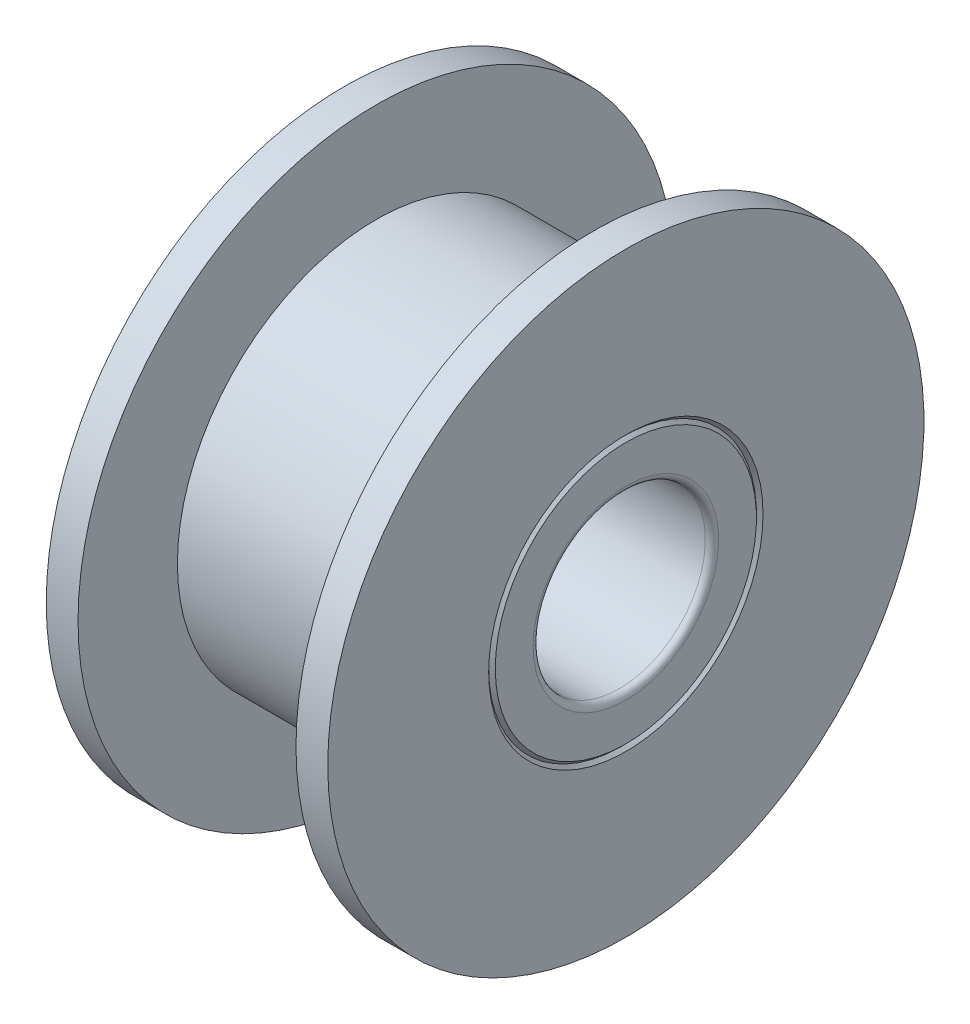
ISO-10303-21;
HEADER;
FILE_DESCRIPTION(('STEP AP214'),'2;1');
FILE_NAME('part.step','',(''),(''),'','','');
FILE_SCHEMA(('AUTOMOTIVE_DESIGN { 1 0 10303 214 1 1 1 1 }'));
ENDSEC;
DATA;
#1=APPLICATION_CONTEXT('core data for automotive mechanical design processes');
#2=APPLICATION_PROTOCOL_DEFINITION('international standard','automotive_design',2000,#1);
#3=PRODUCT_CONTEXT('',#1,'mechanical');
#4=PRODUCT('Part','Part','',(#3));
#5=PRODUCT_RELATED_PRODUCT_CATEGORY('part','',(#4));
#6=PRODUCT_DEFINITION_FORMATION('','',#4);
#7=PRODUCT_DEFINITION_CONTEXT('part definition',#1,'design');
#8=PRODUCT_DEFINITION('design','',#6,#7);
#9=PRODUCT_DEFINITION_SHAPE('','',#8);
#10=(LENGTH_UNIT() NAMED_UNIT(*) SI_UNIT(.MILLI.,.METRE.));
#11=(NAMED_UNIT(*) PLANE_ANGLE_UNIT() SI_UNIT($,.RADIAN.));
#12=(NAMED_UNIT(*) SI_UNIT($,.STERADIAN.) SOLID_ANGLE_UNIT());
#13=UNCERTAINTY_MEASURE_WITH_UNIT(LENGTH_MEASURE(1.E-05),#10,'distance_accuracy_value','');
#14=(GEOMETRIC_REPRESENTATION_CONTEXT(3) GLOBAL_UNCERTAINTY_ASSIGNED_CONTEXT((#13)) GLOBAL_UNIT_ASSIGNED_CONTEXT((#10,
#11,#12)) REPRESENTATION_CONTEXT('',''));
#15=CARTESIAN_POINT('',(0.,0.,0.));
#16=DIRECTION('',(0.,0.,1.));
#17=DIRECTION('',(1.,0.,0.));
#18=AXIS2_PLACEMENT_3D('',#15,#16,#17);
#19=CARTESIAN_POINT('',(5.5,-1.5,0.));
#20=DIRECTION('',(1.,0.,0.));
#21=DIRECTION('',(0.,0.,-1.));
#22=AXIS2_PLACEMENT_3D('',#19,#20,#21);
#23=CONICAL_SURFACE('',#22,3.85760839057917,0.942292393865584);
#24=CARTESIAN_POINT('',(5.60349390049167,-1.5,0.));
#25=DIRECTION('',(-1.,0.,0.));
#26=DIRECTION('',(0.,0.,1.));
#27=AXIS2_PLACEMENT_3D('',#24,#25,#26);
#28=CIRCLE('',#27,4.);
#29=CARTESIAN_POINT('',(5.60349390049167,-1.5,4.));
#30=VERTEX_POINT('',#29);
#31=EDGE_CURVE('E97',#30,#30,#28,.T.);
#32=ORIENTED_EDGE('',*,*,#31,.T.);
#33=EDGE_LOOP('',(#32));
#34=FACE_BOUND('',#33,.T.);
#35=CARTESIAN_POINT('',(5.5,-1.5,0.));
#36=DIRECTION('',(-1.,0.,0.));
#37=DIRECTION('',(0.,0.,1.));
#38=AXIS2_PLACEMENT_3D('',#35,#36,#37);
#39=CIRCLE('',#38,3.85760839057917);
#40=CARTESIAN_POINT('',(5.5,-1.5,3.85760839057917));
#41=VERTEX_POINT('',#40);
#42=EDGE_CURVE('E64',#41,#41,#39,.T.);
#43=ORIENTED_EDGE('',*,*,#42,.F.);
#44=EDGE_LOOP('',(#43));
#45=FACE_BOUND('',#44,.T.);
#46=ADVANCED_FACE('F44',(#34,#45),#23,.T.);
#47=CARTESIAN_POINT('',(5.5,0.,0.));
#48=DIRECTION('',(1.,0.,0.));
#49=DIRECTION('',(0.,0.,-1.));
#50=AXIS2_PLACEMENT_3D('',#47,#48,#49);
#51=PLANE('',#50);
#52=CARTESIAN_POINT('',(5.5,-1.5,0.));
#53=DIRECTION('',(1.,0.,0.));
#54=DIRECTION('',(0.,0.,-1.));
#55=AXIS2_PLACEMENT_3D('',#52,#53,#54);
#56=CIRCLE('',#55,2.8);
#57=CARTESIAN_POINT('',(5.5,-1.5,-2.8));
#58=VERTEX_POINT('',#57);
#59=EDGE_CURVE('E12',#58,#58,#56,.T.);
#60=ORIENTED_EDGE('',*,*,#59,.T.);
#61=EDGE_LOOP('',(#60));
#62=FACE_BOUND('',#61,.T.);
#63=ORIENTED_EDGE('',*,*,#42,.T.);
#64=EDGE_LOOP('',(#63));
#65=FACE_BOUND('',#64,.T.);
#66=ADVANCED_FACE('F118',(#62,#65),#51,.F.);
#67=CARTESIAN_POINT('',(0.999999999999999,-1.5,0.));
#68=DIRECTION('',(-1.,0.,0.));
#69=DIRECTION('',(0.,0.,1.));
#70=AXIS2_PLACEMENT_3D('',#67,#68,#69);
#71=CYLINDRICAL_SURFACE('',#70,2.6);
#72=CARTESIAN_POINT('',(13.8,-1.5,0.));
#73=DIRECTION('',(-1.,0.,0.));
#74=DIRECTION('',(0.,0.,1.));
#75=AXIS2_PLACEMENT_3D('',#72,#73,#74);
#76=CIRCLE('',#75,2.6);
#77=CARTESIAN_POINT('',(13.8,-1.5,2.6));
#78=VERTEX_POINT('',#77);
#79=EDGE_CURVE('E51',#78,#78,#76,.F.);
#80=ORIENTED_EDGE('',*,*,#79,.T.);
#81=EDGE_LOOP('',(#80));
#82=FACE_BOUND('',#81,.T.);
#83=CARTESIAN_POINT('',(5.7,-1.5,0.));
#84=DIRECTION('',(1.,0.,0.));
#85=DIRECTION('',(0.,0.,-1.));
#86=AXIS2_PLACEMENT_3D('',#83,#84,#85);
#87=CIRCLE('',#86,2.6);
#88=CARTESIAN_POINT('',(5.7,-1.5,-2.6));
#89=VERTEX_POINT('',#88);
#90=EDGE_CURVE('E55',#89,#89,#87,.F.);
#91=ORIENTED_EDGE('',*,*,#90,.T.);
#92=EDGE_LOOP('',(#91));
#93=FACE_BOUND('',#92,.T.);
#94=ADVANCED_FACE('F123',(#82,#93),#71,.F.);
#95=CARTESIAN_POINT('',(14.,0.,0.));
#96=DIRECTION('',(-1.,0.,0.));
#97=DIRECTION('',(0.,0.,1.));
#98=AXIS2_PLACEMENT_3D('',#95,#96,#97);
#99=PLANE('',#98);
#100=CARTESIAN_POINT('',(14.,-1.5,0.));
#101=DIRECTION('',(-1.,0.,0.));
#102=DIRECTION('',(0.,0.,1.));
#103=AXIS2_PLACEMENT_3D('',#100,#101,#102);
#104=CIRCLE('',#103,2.8);
#105=CARTESIAN_POINT('',(14.,-1.5,2.8));
#106=VERTEX_POINT('',#105);
#107=EDGE_CURVE('E59',#106,#106,#104,.T.);
#108=ORIENTED_EDGE('',*,*,#107,.T.);
#109=EDGE_LOOP('',(#108));
#110=FACE_BOUND('',#109,.T.);
#111=CARTESIAN_POINT('',(14.,-1.5,0.));
#112=DIRECTION('',(-1.,0.,0.));
#113=DIRECTION('',(0.,0.,1.));
#114=AXIS2_PLACEMENT_3D('',#111,#112,#113);
#115=CIRCLE('',#114,3.94239160942083);
#116=CARTESIAN_POINT('',(14.,-1.5,3.94239160942083));
#117=VERTEX_POINT('',#116);
#118=EDGE_CURVE('E67',#117,#117,#115,.T.);
#119=ORIENTED_EDGE('',*,*,#118,.F.);
#120=EDGE_LOOP('',(#119));
#121=FACE_BOUND('',#120,.T.);
#122=ADVANCED_FACE('F128',(#110,#121),#99,.F.);
#123=CARTESIAN_POINT('',(14.,-1.5,0.));
#124=DIRECTION('',(-1.,0.,0.));
#125=DIRECTION('',(0.,0.,1.));
#126=AXIS2_PLACEMENT_3D('',#123,#124,#125);
#127=CONICAL_SURFACE('',#126,3.94239160942083,0.785398163397448);
#128=CARTESIAN_POINT('',(13.9,-1.5,0.));
#129=DIRECTION('',(-1.,0.,0.));
#130=DIRECTION('',(0.,0.,1.));
#131=AXIS2_PLACEMENT_3D('',#128,#129,#130);
#132=CIRCLE('',#131,4.04239160942083);
#133=CARTESIAN_POINT('',(13.9,-1.5,4.04239160942083));
#134=VERTEX_POINT('',#133);
#135=EDGE_CURVE('E70',#134,#134,#132,.T.);
#136=ORIENTED_EDGE('',*,*,#135,.F.);
#137=EDGE_LOOP('',(#136));
#138=FACE_BOUND('',#137,.T.);
#139=ORIENTED_EDGE('',*,*,#118,.T.);
#140=EDGE_LOOP('',(#139));
#141=FACE_BOUND('',#140,.T.);
#142=ADVANCED_FACE('F131',(#138,#141),#127,.T.);
#143=CARTESIAN_POINT('',(13.9,-1.5,0.));
#144=DIRECTION('',(1.,0.,0.));
#145=DIRECTION('',(0.,0.,-1.));
#146=AXIS2_PLACEMENT_3D('',#143,#144,#145);
#147=CONICAL_SURFACE('',#146,4.04239160942083,0.78539816339747);
#148=CARTESIAN_POINT('',(14.,-1.5,0.));
#149=DIRECTION('',(-1.,0.,0.));
#150=DIRECTION('',(0.,0.,1.));
#151=AXIS2_PLACEMENT_3D('',#148,#149,#150);
#152=CIRCLE('',#151,4.14239160942083);
#153=CARTESIAN_POINT('',(14.,-1.5,4.14239160942083));
#154=VERTEX_POINT('',#153);
#155=EDGE_CURVE('E73',#154,#154,#152,.T.);
#156=ORIENTED_EDGE('',*,*,#155,.F.);
#157=EDGE_LOOP('',(#156));
#158=FACE_BOUND('',#157,.T.);
#159=ORIENTED_EDGE('',*,*,#135,.T.);
#160=EDGE_LOOP('',(#159));
#161=FACE_BOUND('',#160,.T.);
#162=ADVANCED_FACE('F135',(#158,#161),#147,.F.);
#163=CARTESIAN_POINT('',(14.,0.,0.));
#164=DIRECTION('',(-1.,0.,0.));
#165=DIRECTION('',(0.,0.,1.));
#166=AXIS2_PLACEMENT_3D('',#163,#164,#165);
#167=PLANE('',#166);
#168=CARTESIAN_POINT('',(14.,-1.5,0.));
#169=DIRECTION('',(-1.,0.,0.));
#170=DIRECTION('',(0.,0.,1.));
#171=AXIS2_PLACEMENT_3D('',#168,#169,#170);
#172=CIRCLE('',#171,9.);
#173=CARTESIAN_POINT('',(14.,-1.5,9.));
#174=VERTEX_POINT('',#173);
#175=EDGE_CURVE('E76',#174,#174,#172,.T.);
#176=ORIENTED_EDGE('',*,*,#175,.F.);
#177=EDGE_LOOP('',(#176));
#178=FACE_BOUND('',#177,.T.);
#179=ORIENTED_EDGE('',*,*,#155,.T.);
#180=EDGE_LOOP('',(#179));
#181=FACE_BOUND('',#180,.T.);
#182=ADVANCED_FACE('F139',(#178,#181),#167,.F.);
#183=CARTESIAN_POINT('',(0.999999999999999,-1.5,0.));
#184=DIRECTION('',(-1.,0.,0.));
#185=DIRECTION('',(0.,0.,1.));
#186=AXIS2_PLACEMENT_3D('',#183,#184,#185);
#187=CYLINDRICAL_SURFACE('',#186,9.);
#188=ORIENTED_EDGE('',*,*,#175,.T.);
#189=EDGE_LOOP('',(#188));
#190=FACE_BOUND('',#189,.T.);
#191=CARTESIAN_POINT('',(13.04,-1.5,0.));
#192=DIRECTION('',(-1.,0.,0.));
#193=DIRECTION('',(0.,0.,1.));
#194=AXIS2_PLACEMENT_3D('',#191,#192,#193);
#195=CIRCLE('',#194,9.);
#196=CARTESIAN_POINT('',(13.04,-1.5,9.));
#197=VERTEX_POINT('',#196);
#198=EDGE_CURVE('E79',#197,#197,#195,.T.);
#199=ORIENTED_EDGE('',*,*,#198,.F.);
#200=EDGE_LOOP('',(#199));
#201=FACE_BOUND('',#200,.T.);
#202=ADVANCED_FACE('F143',(#190,#201),#187,.T.);
#203=CARTESIAN_POINT('',(13.04,0.,0.));
#204=DIRECTION('',(-1.,0.,0.));
#205=DIRECTION('',(0.,0.,1.));
#206=AXIS2_PLACEMENT_3D('',#203,#204,#205);
#207=PLANE('',#206);
#208=ORIENTED_EDGE('',*,*,#198,.T.);
#209=EDGE_LOOP('',(#208));
#210=FACE_BOUND('',#209,.T.);
#211=CARTESIAN_POINT('',(13.04,-1.5,0.));
#212=DIRECTION('',(-1.,0.,0.));
#213=DIRECTION('',(0.,0.,1.));
#214=AXIS2_PLACEMENT_3D('',#211,#212,#213);
#215=CIRCLE('',#214,6.);
#216=CARTESIAN_POINT('',(13.04,-1.5,6.));
#217=VERTEX_POINT('',#216);
#218=EDGE_CURVE('E82',#217,#217,#215,.T.);
#219=ORIENTED_EDGE('',*,*,#218,.F.);
#220=EDGE_LOOP('',(#219));
#221=FACE_BOUND('',#220,.T.);
#222=ADVANCED_FACE('F147',(#210,#221),#207,.T.);
#223=CARTESIAN_POINT('',(0.999999999999999,-1.5,0.));
#224=DIRECTION('',(-1.,0.,0.));
#225=DIRECTION('',(0.,0.,1.));
#226=AXIS2_PLACEMENT_3D('',#223,#224,#225);
#227=CYLINDRICAL_SURFACE('',#226,6.);
#228=ORIENTED_EDGE('',*,*,#218,.T.);
#229=EDGE_LOOP('',(#228));
#230=FACE_BOUND('',#229,.T.);
#231=CARTESIAN_POINT('',(6.46,-1.5,0.));
#232=DIRECTION('',(-1.,0.,0.));
#233=DIRECTION('',(0.,0.,1.));
#234=AXIS2_PLACEMENT_3D('',#231,#232,#233);
#235=CIRCLE('',#234,6.);
#236=CARTESIAN_POINT('',(6.46,-1.5,6.));
#237=VERTEX_POINT('',#236);
#238=EDGE_CURVE('E85',#237,#237,#235,.T.);
#239=ORIENTED_EDGE('',*,*,#238,.F.);
#240=EDGE_LOOP('',(#239));
#241=FACE_BOUND('',#240,.T.);
#242=ADVANCED_FACE('F151',(#230,#241),#227,.T.);
#243=CARTESIAN_POINT('',(6.46,0.,0.));
#244=DIRECTION('',(1.,0.,0.));
#245=DIRECTION('',(0.,0.,-1.));
#246=AXIS2_PLACEMENT_3D('',#243,#244,#245);
#247=PLANE('',#246);
#248=ORIENTED_EDGE('',*,*,#238,.T.);
#249=EDGE_LOOP('',(#248));
#250=FACE_BOUND('',#249,.T.);
#251=CARTESIAN_POINT('',(6.46,-1.5,0.));
#252=DIRECTION('',(-1.,0.,0.));
#253=DIRECTION('',(0.,0.,1.));
#254=AXIS2_PLACEMENT_3D('',#251,#252,#253);
#255=CIRCLE('',#254,9.);
#256=CARTESIAN_POINT('',(6.46,-1.5,9.));
#257=VERTEX_POINT('',#256);
#258=EDGE_CURVE('E88',#257,#257,#255,.T.);
#259=ORIENTED_EDGE('',*,*,#258,.F.);
#260=EDGE_LOOP('',(#259));
#261=FACE_BOUND('',#260,.T.);
#262=ADVANCED_FACE('F155',(#250,#261),#247,.T.);
#263=CARTESIAN_POINT('',(0.999999999999999,-1.5,0.));
#264=DIRECTION('',(-1.,0.,0.));
#265=DIRECTION('',(0.,0.,1.));
#266=AXIS2_PLACEMENT_3D('',#263,#264,#265);
#267=CYLINDRICAL_SURFACE('',#266,9.);
#268=ORIENTED_EDGE('',*,*,#258,.T.);
#269=EDGE_LOOP('',(#268));
#270=FACE_BOUND('',#269,.T.);
#271=CARTESIAN_POINT('',(5.5,-1.5,0.));
#272=DIRECTION('',(-1.,0.,0.));
#273=DIRECTION('',(0.,0.,1.));
#274=AXIS2_PLACEMENT_3D('',#271,#272,#273);
#275=CIRCLE('',#274,9.);
#276=CARTESIAN_POINT('',(5.5,-1.5,9.));
#277=VERTEX_POINT('',#276);
#278=EDGE_CURVE('E91',#277,#277,#275,.T.);
#279=ORIENTED_EDGE('',*,*,#278,.F.);
#280=EDGE_LOOP('',(#279));
#281=FACE_BOUND('',#280,.T.);
#282=ADVANCED_FACE('F114',(#270,#281),#267,.T.);
#283=CARTESIAN_POINT('',(5.5,0.,0.));
#284=DIRECTION('',(1.,0.,0.));
#285=DIRECTION('',(0.,0.,-1.));
#286=AXIS2_PLACEMENT_3D('',#283,#284,#285);
#287=PLANE('',#286);
#288=CARTESIAN_POINT('',(5.5,-1.5,0.));
#289=DIRECTION('',(-1.,0.,0.));
#290=DIRECTION('',(0.,0.,1.));
#291=AXIS2_PLACEMENT_3D('',#288,#289,#290);
#292=CIRCLE('',#291,4.14239160942083);
#293=CARTESIAN_POINT('',(5.5,-1.5,4.14239160942083));
#294=VERTEX_POINT('',#293);
#295=EDGE_CURVE('E94',#294,#294,#292,.T.);
#296=ORIENTED_EDGE('',*,*,#295,.F.);
#297=EDGE_LOOP('',(#296));
#298=FACE_BOUND('',#297,.T.);
#299=ORIENTED_EDGE('',*,*,#278,.T.);
#300=EDGE_LOOP('',(#299));
#301=FACE_BOUND('',#300,.T.);
#302=ADVANCED_FACE('F106',(#298,#301),#287,.F.);
#303=CARTESIAN_POINT('',(5.60349390049167,-1.5,0.));
#304=DIRECTION('',(-1.,0.,0.));
#305=DIRECTION('',(0.,0.,1.));
#306=AXIS2_PLACEMENT_3D('',#303,#304,#305);
#307=CONICAL_SURFACE('',#306,4.,0.942292393865592);
#308=ORIENTED_EDGE('',*,*,#295,.T.);
#309=EDGE_LOOP('',(#308));
#310=FACE_BOUND('',#309,.T.);
#311=ORIENTED_EDGE('',*,*,#31,.F.);
#312=EDGE_LOOP('',(#311));
#313=FACE_BOUND('',#312,.T.);
#314=ADVANCED_FACE('F103',(#310,#313),#307,.F.);
#315=CARTESIAN_POINT('',(13.8,-1.5,0.));
#316=DIRECTION('',(-1.,0.,0.));
#317=DIRECTION('',(0.,0.,1.));
#318=AXIS2_PLACEMENT_3D('',#315,#316,#317);
#319=TOROIDAL_SURFACE('',#318,2.8,0.2);
#320=ORIENTED_EDGE('',*,*,#79,.F.);
#321=EDGE_LOOP('',(#320));
#322=FACE_BOUND('',#321,.T.);
#323=ORIENTED_EDGE('',*,*,#107,.F.);
#324=EDGE_LOOP('',(#323));
#325=FACE_BOUND('',#324,.T.);
#326=ADVANCED_FACE('F105',(#322,#325),#319,.T.);
#327=CARTESIAN_POINT('',(5.7,-1.5,0.));
#328=DIRECTION('',(1.,0.,0.));
#329=DIRECTION('',(0.,0.,-1.));
#330=AXIS2_PLACEMENT_3D('',#327,#328,#329);
#331=TOROIDAL_SURFACE('',#330,2.8,0.2);
#332=ORIENTED_EDGE('',*,*,#59,.F.);
#333=EDGE_LOOP('',(#332));
#334=FACE_BOUND('',#333,.T.);
#335=ORIENTED_EDGE('',*,*,#90,.F.);
#336=EDGE_LOOP('',(#335));
#337=FACE_BOUND('',#336,.T.);
#338=ADVANCED_FACE('F46',(#334,#337),#331,.T.);
#339=CLOSED_SHELL('',(#46,#66,#94,#122,#142,#162,#182,#202,#222,#242,#262,#282,#302,#314,#326,#338));
#340=MANIFOLD_SOLID_BREP('B2',#339);
#341=ADVANCED_BREP_SHAPE_REPRESENTATION('',(#18,#340),#14);
#342=SHAPE_DEFINITION_REPRESENTATION(#9,#341);
ENDSEC;
END-ISO-10303-21;
